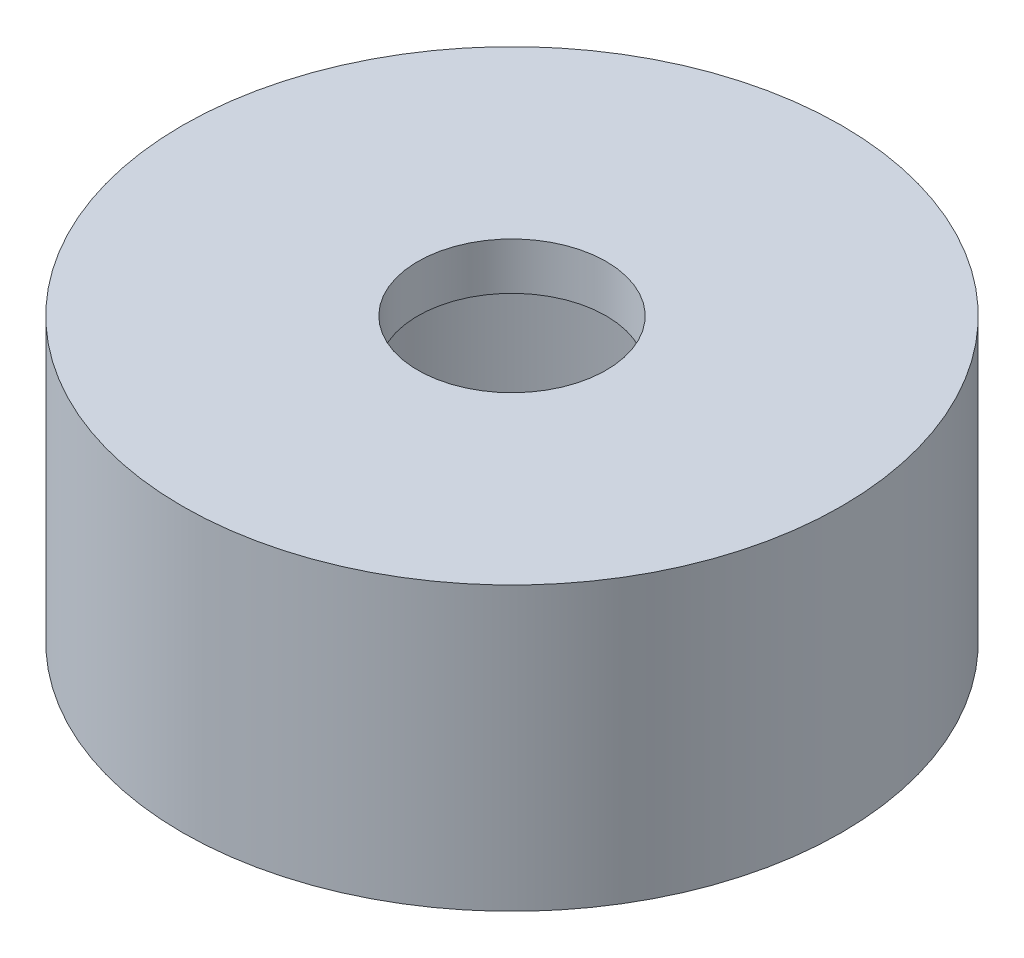
ISO-10303-21;
HEADER;
FILE_DESCRIPTION(('STEP AP214'),'2;1');
FILE_NAME('part.step','',(''),(''),'','','');
FILE_SCHEMA(('AUTOMOTIVE_DESIGN { 1 0 10303 214 1 1 1 1 }'));
ENDSEC;
DATA;
#1=APPLICATION_CONTEXT('core data for automotive mechanical design processes');
#2=APPLICATION_PROTOCOL_DEFINITION('international standard','automotive_design',2000,#1);
#3=PRODUCT_CONTEXT('',#1,'mechanical');
#4=PRODUCT('Part','Part','',(#3));
#5=PRODUCT_RELATED_PRODUCT_CATEGORY('part','',(#4));
#6=PRODUCT_DEFINITION_FORMATION('','',#4);
#7=PRODUCT_DEFINITION_CONTEXT('part definition',#1,'design');
#8=PRODUCT_DEFINITION('design','',#6,#7);
#9=PRODUCT_DEFINITION_SHAPE('','',#8);
#10=(LENGTH_UNIT() NAMED_UNIT(*) SI_UNIT(.MILLI.,.METRE.));
#11=(NAMED_UNIT(*) PLANE_ANGLE_UNIT() SI_UNIT($,.RADIAN.));
#12=(NAMED_UNIT(*) SI_UNIT($,.STERADIAN.) SOLID_ANGLE_UNIT());
#13=UNCERTAINTY_MEASURE_WITH_UNIT(LENGTH_MEASURE(1.E-05),#10,'distance_accuracy_value','');
#14=(GEOMETRIC_REPRESENTATION_CONTEXT(3) GLOBAL_UNCERTAINTY_ASSIGNED_CONTEXT((#13)) GLOBAL_UNIT_ASSIGNED_CONTEXT((#10,
#11,#12)) REPRESENTATION_CONTEXT('',''));
#15=CARTESIAN_POINT('',(0.,0.,0.));
#16=DIRECTION('',(0.,0.,1.));
#17=DIRECTION('',(1.,0.,0.));
#18=AXIS2_PLACEMENT_3D('',#15,#16,#17);
#19=CARTESIAN_POINT('',(-14.,0.,0.));
#20=DIRECTION('',(0.,1.,0.));
#21=DIRECTION('',(0.,0.,1.));
#22=AXIS2_PLACEMENT_3D('',#19,#20,#21);
#23=PLANE('',#22);
#24=CARTESIAN_POINT('',(0.,0.,0.));
#25=DIRECTION('',(0.,-1.,0.));
#26=DIRECTION('',(0.,0.,-1.));
#27=AXIS2_PLACEMENT_3D('',#24,#25,#26);
#28=CIRCLE('',#27,12.);
#29=CARTESIAN_POINT('',(0.,0.,-12.));
#30=VERTEX_POINT('',#29);
#31=EDGE_CURVE('E10',#30,#30,#28,.T.);
#32=ORIENTED_EDGE('',*,*,#31,.F.);
#33=EDGE_LOOP('',(#32));
#34=FACE_BOUND('',#33,.T.);
#35=CARTESIAN_POINT('',(0.,0.,0.));
#36=DIRECTION('',(0.,-1.,0.));
#37=DIRECTION('',(0.,0.,-1.));
#38=AXIS2_PLACEMENT_3D('',#35,#36,#37);
#39=CIRCLE('',#38,14.);
#40=CARTESIAN_POINT('',(0.,0.,-14.));
#41=VERTEX_POINT('',#40);
#42=EDGE_CURVE('E59',#41,#41,#39,.T.);
#43=ORIENTED_EDGE('',*,*,#42,.T.);
#44=EDGE_LOOP('',(#43));
#45=FACE_BOUND('',#44,.T.);
#46=ADVANCED_FACE('F37',(#34,#45),#23,.F.);
#47=CARTESIAN_POINT('',(0.,0.,0.));
#48=DIRECTION('',(0.,-1.,0.));
#49=DIRECTION('',(0.,0.,-1.));
#50=AXIS2_PLACEMENT_3D('',#47,#48,#49);
#51=CYLINDRICAL_SURFACE('',#50,12.);
#52=CARTESIAN_POINT('',(0.,10.,0.));
#53=DIRECTION('',(0.,-1.,0.));
#54=DIRECTION('',(0.,0.,-1.));
#55=AXIS2_PLACEMENT_3D('',#52,#53,#54);
#56=CIRCLE('',#55,12.);
#57=CARTESIAN_POINT('',(0.,10.,-12.));
#58=VERTEX_POINT('',#57);
#59=EDGE_CURVE('E43',#58,#58,#56,.T.);
#60=ORIENTED_EDGE('',*,*,#59,.F.);
#61=EDGE_LOOP('',(#60));
#62=FACE_BOUND('',#61,.T.);
#63=ORIENTED_EDGE('',*,*,#31,.T.);
#64=EDGE_LOOP('',(#63));
#65=FACE_BOUND('',#64,.T.);
#66=ADVANCED_FACE('F84',(#62,#65),#51,.F.);
#67=CARTESIAN_POINT('',(-12.,10.,0.));
#68=DIRECTION('',(0.,1.,0.));
#69=DIRECTION('',(0.,0.,1.));
#70=AXIS2_PLACEMENT_3D('',#67,#68,#69);
#71=PLANE('',#70);
#72=CARTESIAN_POINT('',(0.,10.,0.));
#73=DIRECTION('',(0.,-1.,0.));
#74=DIRECTION('',(0.,0.,-1.));
#75=AXIS2_PLACEMENT_3D('',#72,#73,#74);
#76=CIRCLE('',#75,4.);
#77=CARTESIAN_POINT('',(0.,10.,-4.));
#78=VERTEX_POINT('',#77);
#79=EDGE_CURVE('E47',#78,#78,#76,.T.);
#80=ORIENTED_EDGE('',*,*,#79,.F.);
#81=EDGE_LOOP('',(#80));
#82=FACE_BOUND('',#81,.T.);
#83=ORIENTED_EDGE('',*,*,#59,.T.);
#84=EDGE_LOOP('',(#83));
#85=FACE_BOUND('',#84,.T.);
#86=ADVANCED_FACE('F79',(#82,#85),#71,.F.);
#87=CARTESIAN_POINT('',(0.,0.,0.));
#88=DIRECTION('',(0.,-1.,0.));
#89=DIRECTION('',(0.,0.,-1.));
#90=AXIS2_PLACEMENT_3D('',#87,#88,#89);
#91=CYLINDRICAL_SURFACE('',#90,4.);
#92=CARTESIAN_POINT('',(0.,12.,0.));
#93=DIRECTION('',(0.,-1.,0.));
#94=DIRECTION('',(0.,0.,-1.));
#95=AXIS2_PLACEMENT_3D('',#92,#93,#94);
#96=CIRCLE('',#95,4.);
#97=CARTESIAN_POINT('',(0.,12.,-4.));
#98=VERTEX_POINT('',#97);
#99=EDGE_CURVE('E51',#98,#98,#96,.T.);
#100=ORIENTED_EDGE('',*,*,#99,.F.);
#101=EDGE_LOOP('',(#100));
#102=FACE_BOUND('',#101,.T.);
#103=ORIENTED_EDGE('',*,*,#79,.T.);
#104=EDGE_LOOP('',(#103));
#105=FACE_BOUND('',#104,.T.);
#106=ADVANCED_FACE('F73',(#102,#105),#91,.F.);
#107=CARTESIAN_POINT('',(-4.,12.,0.));
#108=DIRECTION('',(0.,-1.,0.));
#109=DIRECTION('',(0.,0.,-1.));
#110=AXIS2_PLACEMENT_3D('',#107,#108,#109);
#111=PLANE('',#110);
#112=CARTESIAN_POINT('',(0.,12.,0.));
#113=DIRECTION('',(0.,-1.,0.));
#114=DIRECTION('',(0.,0.,-1.));
#115=AXIS2_PLACEMENT_3D('',#112,#113,#114);
#116=CIRCLE('',#115,14.);
#117=CARTESIAN_POINT('',(0.,12.,-14.));
#118=VERTEX_POINT('',#117);
#119=EDGE_CURVE('E56',#118,#118,#116,.T.);
#120=ORIENTED_EDGE('',*,*,#119,.F.);
#121=EDGE_LOOP('',(#120));
#122=FACE_BOUND('',#121,.T.);
#123=ORIENTED_EDGE('',*,*,#99,.T.);
#124=EDGE_LOOP('',(#123));
#125=FACE_BOUND('',#124,.T.);
#126=ADVANCED_FACE('F67',(#122,#125),#111,.F.);
#127=CARTESIAN_POINT('',(0.,0.,0.));
#128=DIRECTION('',(0.,-1.,0.));
#129=DIRECTION('',(0.,0.,-1.));
#130=AXIS2_PLACEMENT_3D('',#127,#128,#129);
#131=CYLINDRICAL_SURFACE('',#130,14.);
#132=ORIENTED_EDGE('',*,*,#42,.F.);
#133=EDGE_LOOP('',(#132));
#134=FACE_BOUND('',#133,.T.);
#135=ORIENTED_EDGE('',*,*,#119,.T.);
#136=EDGE_LOOP('',(#135));
#137=FACE_BOUND('',#136,.T.);
#138=ADVANCED_FACE('F64',(#134,#137),#131,.T.);
#139=CLOSED_SHELL('',(#46,#66,#86,#106,#126,#138));
#140=MANIFOLD_SOLID_BREP('B2',#139);
#141=ADVANCED_BREP_SHAPE_REPRESENTATION('',(#18,#140),#14);
#142=SHAPE_DEFINITION_REPRESENTATION(#9,#141);
ENDSEC;
END-ISO-10303-21;
